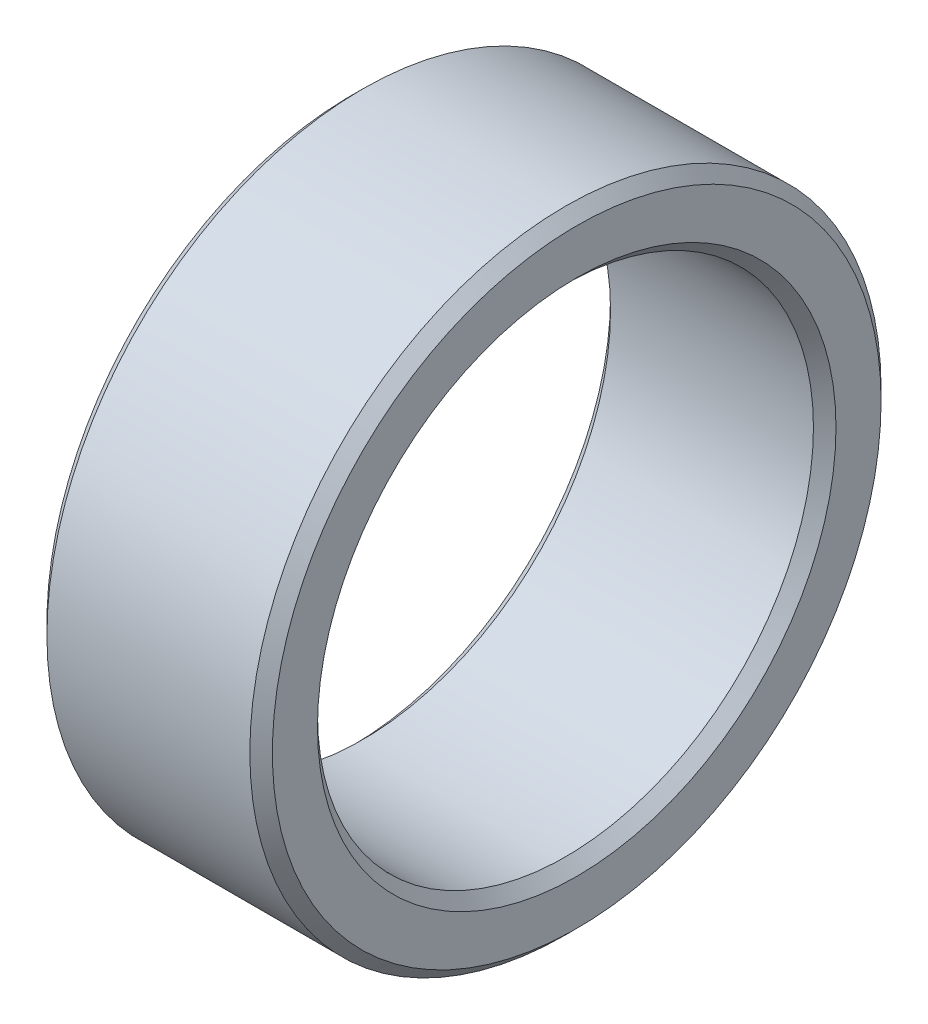
ISO-10303-21;
HEADER;
FILE_DESCRIPTION(('STEP AP214'),'2;1');
FILE_NAME('part.step','',(''),(''),'','','');
FILE_SCHEMA(('AUTOMOTIVE_DESIGN { 1 0 10303 214 1 1 1 1 }'));
ENDSEC;
DATA;
#1=APPLICATION_CONTEXT('core data for automotive mechanical design processes');
#2=APPLICATION_PROTOCOL_DEFINITION('international standard','automotive_design',2000,#1);
#3=PRODUCT_CONTEXT('',#1,'mechanical');
#4=PRODUCT('Part','Part','',(#3));
#5=PRODUCT_RELATED_PRODUCT_CATEGORY('part','',(#4));
#6=PRODUCT_DEFINITION_FORMATION('','',#4);
#7=PRODUCT_DEFINITION_CONTEXT('part definition',#1,'design');
#8=PRODUCT_DEFINITION('design','',#6,#7);
#9=PRODUCT_DEFINITION_SHAPE('','',#8);
#10=(LENGTH_UNIT() NAMED_UNIT(*) SI_UNIT(.MILLI.,.METRE.));
#11=(NAMED_UNIT(*) PLANE_ANGLE_UNIT() SI_UNIT($,.RADIAN.));
#12=(NAMED_UNIT(*) SI_UNIT($,.STERADIAN.) SOLID_ANGLE_UNIT());
#13=UNCERTAINTY_MEASURE_WITH_UNIT(LENGTH_MEASURE(1.E-05),#10,'distance_accuracy_value','');
#14=(GEOMETRIC_REPRESENTATION_CONTEXT(3) GLOBAL_UNCERTAINTY_ASSIGNED_CONTEXT((#13)) GLOBAL_UNIT_ASSIGNED_CONTEXT((#10,
#11,#12)) REPRESENTATION_CONTEXT('',''));
#15=CARTESIAN_POINT('',(0.,0.,0.));
#16=DIRECTION('',(0.,0.,1.));
#17=DIRECTION('',(1.,0.,0.));
#18=AXIS2_PLACEMENT_3D('',#15,#16,#17);
#19=CARTESIAN_POINT('',(0.,13.4999999999998,0.));
#20=DIRECTION('',(-1.,0.,0.));
#21=DIRECTION('',(0.,0.,1.));
#22=AXIS2_PLACEMENT_3D('',#19,#20,#21);
#23=PLANE('',#22);
#24=CARTESIAN_POINT('',(0.,0.,0.));
#25=DIRECTION('',(1.,0.,0.));
#26=DIRECTION('',(0.,0.,-1.));
#27=AXIS2_PLACEMENT_3D('',#24,#25,#26);
#28=CIRCLE('',#27,11.5);
#29=CARTESIAN_POINT('',(0.,0.,-11.5));
#30=VERTEX_POINT('',#29);
#31=EDGE_CURVE('E10',#30,#30,#28,.T.);
#32=ORIENTED_EDGE('',*,*,#31,.T.);
#33=EDGE_LOOP('',(#32));
#34=FACE_BOUND('',#33,.T.);
#35=CARTESIAN_POINT('',(0.,0.,0.));
#36=DIRECTION('',(1.,0.,0.));
#37=DIRECTION('',(0.,0.,-1.));
#38=AXIS2_PLACEMENT_3D('',#35,#36,#37);
#39=CIRCLE('',#38,13.4999999999998);
#40=CARTESIAN_POINT('',(0.,0.,-13.4999999999998));
#41=VERTEX_POINT('',#40);
#42=EDGE_CURVE('E59',#41,#41,#39,.T.);
#43=ORIENTED_EDGE('',*,*,#42,.F.);
#44=EDGE_LOOP('',(#43));
#45=FACE_BOUND('',#44,.T.);
#46=ADVANCED_FACE('F31',(#34,#45),#23,.T.);
#47=CARTESIAN_POINT('',(0.,0.,0.));
#48=DIRECTION('',(-1.,0.,0.));
#49=DIRECTION('',(0.,0.,1.));
#50=AXIS2_PLACEMENT_3D('',#47,#48,#49);
#51=CONICAL_SURFACE('',#50,11.5,0.785398163397449);
#52=CARTESIAN_POINT('',(0.5,0.,0.));
#53=DIRECTION('',(1.,0.,0.));
#54=DIRECTION('',(0.,0.,-1.));
#55=AXIS2_PLACEMENT_3D('',#52,#53,#54);
#56=CIRCLE('',#55,11.);
#57=CARTESIAN_POINT('',(0.5,0.,-11.));
#58=VERTEX_POINT('',#57);
#59=EDGE_CURVE('E37',#58,#58,#56,.T.);
#60=ORIENTED_EDGE('',*,*,#59,.T.);
#61=EDGE_LOOP('',(#60));
#62=FACE_BOUND('',#61,.T.);
#63=ORIENTED_EDGE('',*,*,#31,.F.);
#64=EDGE_LOOP('',(#63));
#65=FACE_BOUND('',#64,.T.);
#66=ADVANCED_FACE('F67',(#62,#65),#51,.F.);
#67=CARTESIAN_POINT('',(0.,0.,0.));
#68=DIRECTION('',(1.,0.,0.));
#69=DIRECTION('',(0.,0.,-1.));
#70=AXIS2_PLACEMENT_3D('',#67,#68,#69);
#71=CYLINDRICAL_SURFACE('',#70,11.);
#72=CARTESIAN_POINT('',(9.5,0.,0.));
#73=DIRECTION('',(1.,0.,0.));
#74=DIRECTION('',(0.,0.,-1.));
#75=AXIS2_PLACEMENT_3D('',#72,#73,#74);
#76=CIRCLE('',#75,11.);
#77=CARTESIAN_POINT('',(9.5,0.,-11.));
#78=VERTEX_POINT('',#77);
#79=EDGE_CURVE('E41',#78,#78,#76,.T.);
#80=ORIENTED_EDGE('',*,*,#79,.T.);
#81=EDGE_LOOP('',(#80));
#82=FACE_BOUND('',#81,.T.);
#83=ORIENTED_EDGE('',*,*,#59,.F.);
#84=EDGE_LOOP('',(#83));
#85=FACE_BOUND('',#84,.T.);
#86=ADVANCED_FACE('F71',(#82,#85),#71,.F.);
#87=CARTESIAN_POINT('',(9.5,0.,0.));
#88=DIRECTION('',(1.,0.,0.));
#89=DIRECTION('',(0.,0.,-1.));
#90=AXIS2_PLACEMENT_3D('',#87,#88,#89);
#91=CONICAL_SURFACE('',#90,11.,0.785398163397448);
#92=CARTESIAN_POINT('',(10.,0.,0.));
#93=DIRECTION('',(1.,0.,0.));
#94=DIRECTION('',(0.,0.,-1.));
#95=AXIS2_PLACEMENT_3D('',#92,#93,#94);
#96=CIRCLE('',#95,11.5);
#97=CARTESIAN_POINT('',(10.,0.,-11.5));
#98=VERTEX_POINT('',#97);
#99=EDGE_CURVE('E45',#98,#98,#96,.T.);
#100=ORIENTED_EDGE('',*,*,#99,.T.);
#101=EDGE_LOOP('',(#100));
#102=FACE_BOUND('',#101,.T.);
#103=ORIENTED_EDGE('',*,*,#79,.F.);
#104=EDGE_LOOP('',(#103));
#105=FACE_BOUND('',#104,.T.);
#106=ADVANCED_FACE('F75',(#102,#105),#91,.F.);
#107=CARTESIAN_POINT('',(10.,11.5,0.));
#108=DIRECTION('',(1.,0.,0.));
#109=DIRECTION('',(0.,0.,-1.));
#110=AXIS2_PLACEMENT_3D('',#107,#108,#109);
#111=PLANE('',#110);
#112=CARTESIAN_POINT('',(10.,0.,0.));
#113=DIRECTION('',(1.,0.,0.));
#114=DIRECTION('',(0.,0.,-1.));
#115=AXIS2_PLACEMENT_3D('',#112,#113,#114);
#116=CIRCLE('',#115,13.4999999999998);
#117=CARTESIAN_POINT('',(10.,0.,-13.4999999999998));
#118=VERTEX_POINT('',#117);
#119=EDGE_CURVE('E50',#118,#118,#116,.T.);
#120=ORIENTED_EDGE('',*,*,#119,.T.);
#121=EDGE_LOOP('',(#120));
#122=FACE_BOUND('',#121,.T.);
#123=ORIENTED_EDGE('',*,*,#99,.F.);
#124=EDGE_LOOP('',(#123));
#125=FACE_BOUND('',#124,.T.);
#126=ADVANCED_FACE('F82',(#122,#125),#111,.T.);
#127=CARTESIAN_POINT('',(10.,0.,0.));
#128=DIRECTION('',(-1.,0.,0.));
#129=DIRECTION('',(0.,0.,1.));
#130=AXIS2_PLACEMENT_3D('',#127,#128,#129);
#131=CONICAL_SURFACE('',#130,13.4999999999998,0.78539816339745);
#132=CARTESIAN_POINT('',(9.5,0.,0.));
#133=DIRECTION('',(1.,0.,0.));
#134=DIRECTION('',(0.,0.,-1.));
#135=AXIS2_PLACEMENT_3D('',#132,#133,#134);
#136=CIRCLE('',#135,13.9999999999998);
#137=CARTESIAN_POINT('',(9.5,0.,-13.9999999999998));
#138=VERTEX_POINT('',#137);
#139=EDGE_CURVE('E53',#138,#138,#136,.T.);
#140=ORIENTED_EDGE('',*,*,#139,.T.);
#141=EDGE_LOOP('',(#140));
#142=FACE_BOUND('',#141,.T.);
#143=ORIENTED_EDGE('',*,*,#119,.F.);
#144=EDGE_LOOP('',(#143));
#145=FACE_BOUND('',#144,.T.);
#146=ADVANCED_FACE('F86',(#142,#145),#131,.T.);
#147=CARTESIAN_POINT('',(0.,0.,0.));
#148=DIRECTION('',(1.,0.,0.));
#149=DIRECTION('',(0.,0.,-1.));
#150=AXIS2_PLACEMENT_3D('',#147,#148,#149);
#151=CYLINDRICAL_SURFACE('',#150,13.9999999999998);
#152=CARTESIAN_POINT('',(0.5,0.,0.));
#153=DIRECTION('',(1.,0.,0.));
#154=DIRECTION('',(0.,0.,-1.));
#155=AXIS2_PLACEMENT_3D('',#152,#153,#154);
#156=CIRCLE('',#155,13.9999999999998);
#157=CARTESIAN_POINT('',(0.5,0.,-13.9999999999998));
#158=VERTEX_POINT('',#157);
#159=EDGE_CURVE('E56',#158,#158,#156,.T.);
#160=ORIENTED_EDGE('',*,*,#159,.T.);
#161=EDGE_LOOP('',(#160));
#162=FACE_BOUND('',#161,.T.);
#163=ORIENTED_EDGE('',*,*,#139,.F.);
#164=EDGE_LOOP('',(#163));
#165=FACE_BOUND('',#164,.T.);
#166=ADVANCED_FACE('F90',(#162,#165),#151,.T.);
#167=CARTESIAN_POINT('',(0.5,0.,0.));
#168=DIRECTION('',(1.,0.,0.));
#169=DIRECTION('',(0.,0.,-1.));
#170=AXIS2_PLACEMENT_3D('',#167,#168,#169);
#171=CONICAL_SURFACE('',#170,13.9999999999998,0.78539816339745);
#172=ORIENTED_EDGE('',*,*,#42,.T.);
#173=EDGE_LOOP('',(#172));
#174=FACE_BOUND('',#173,.T.);
#175=ORIENTED_EDGE('',*,*,#159,.F.);
#176=EDGE_LOOP('',(#175));
#177=FACE_BOUND('',#176,.T.);
#178=ADVANCED_FACE('F63',(#174,#177),#171,.T.);
#179=CLOSED_SHELL('',(#46,#66,#86,#106,#126,#146,#166,#178));
#180=MANIFOLD_SOLID_BREP('B2',#179);
#181=ADVANCED_BREP_SHAPE_REPRESENTATION('',(#18,#180),#14);
#182=SHAPE_DEFINITION_REPRESENTATION(#9,#181);
ENDSEC;
END-ISO-10303-21;
